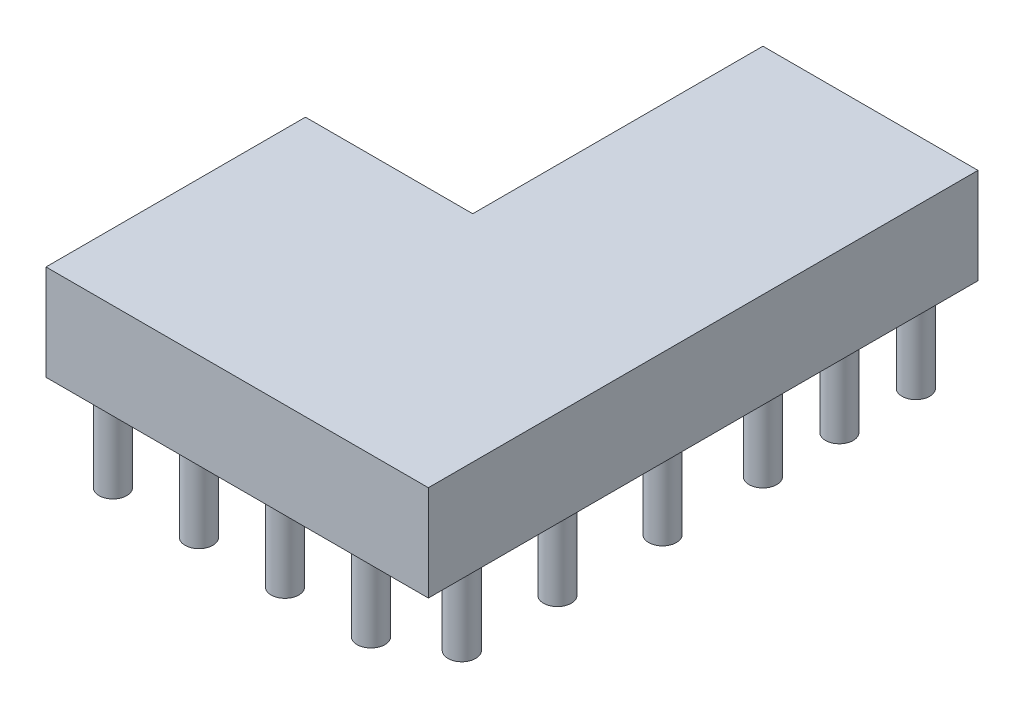
ISO-10303-21;
HEADER;
FILE_DESCRIPTION(('STEP AP214'),'2;1');
FILE_NAME('part.step','',(''),(''),'','','');
FILE_SCHEMA(('AUTOMOTIVE_DESIGN { 1 0 10303 214 1 1 1 1 }'));
ENDSEC;
DATA;
#1=APPLICATION_CONTEXT('core data for automotive mechanical design processes');
#2=APPLICATION_PROTOCOL_DEFINITION('international standard','automotive_design',2000,#1);
#3=PRODUCT_CONTEXT('',#1,'mechanical');
#4=PRODUCT('Part','Part','',(#3));
#5=PRODUCT_RELATED_PRODUCT_CATEGORY('part','',(#4));
#6=PRODUCT_DEFINITION_FORMATION('','',#4);
#7=PRODUCT_DEFINITION_CONTEXT('part definition',#1,'design');
#8=PRODUCT_DEFINITION('design','',#6,#7);
#9=PRODUCT_DEFINITION_SHAPE('','',#8);
#10=(LENGTH_UNIT() NAMED_UNIT(*) SI_UNIT(.MILLI.,.METRE.));
#11=(NAMED_UNIT(*) PLANE_ANGLE_UNIT() SI_UNIT($,.RADIAN.));
#12=(NAMED_UNIT(*) SI_UNIT($,.STERADIAN.) SOLID_ANGLE_UNIT());
#13=UNCERTAINTY_MEASURE_WITH_UNIT(LENGTH_MEASURE(1.E-05),#10,'distance_accuracy_value','');
#14=(GEOMETRIC_REPRESENTATION_CONTEXT(3) GLOBAL_UNCERTAINTY_ASSIGNED_CONTEXT((#13)) GLOBAL_UNIT_ASSIGNED_CONTEXT((#10,
#11,#12)) REPRESENTATION_CONTEXT('',''));
#15=CARTESIAN_POINT('',(0.,0.,0.));
#16=DIRECTION('',(0.,0.,1.));
#17=DIRECTION('',(1.,0.,0.));
#18=AXIS2_PLACEMENT_3D('',#15,#16,#17);
#19=CARTESIAN_POINT('',(-30.7782651691458,-20.,2.6856654690313));
#20=DIRECTION('',(0.,0.,-1.));
#21=DIRECTION('',(-1.,0.,0.));
#22=AXIS2_PLACEMENT_3D('',#19,#20,#21);
#23=PLANE('',#22);
#24=DIRECTION('',(-1.,0.,0.));
#25=VECTOR('',#24,1.);
#26=CARTESIAN_POINT('',(-30.7782651691458,0.,2.6856654690313));
#27=LINE('',#26,#25);
#28=CARTESIAN_POINT('',(-4.7863472081604,0.,2.6856654690313));
#29=VERTEX_POINT('',#28);
#30=CARTESIAN_POINT('',(-39.7863472081604,0.,2.6856654690313));
#31=VERTEX_POINT('',#30);
#32=EDGE_CURVE('E157',#29,#31,#27,.T.);
#33=ORIENTED_EDGE('',*,*,#32,.F.);
#34=DIRECTION('',(0.,1.,0.));
#35=VECTOR('',#34,1.);
#36=CARTESIAN_POINT('',(-4.7863472081604,-20.,2.6856654690313));
#37=LINE('',#36,#35);
#38=CARTESIAN_POINT('',(-4.7863472081604,-20.,2.6856654690313));
#39=VERTEX_POINT('',#38);
#40=EDGE_CURVE('E190',#39,#29,#37,.T.);
#41=ORIENTED_EDGE('',*,*,#40,.F.);
#42=DIRECTION('',(-1.,0.,0.));
#43=VECTOR('',#42,1.);
#44=CARTESIAN_POINT('',(-39.7863472081604,-20.,2.6856654690313));
#45=LINE('',#44,#43);
#46=CARTESIAN_POINT('',(-39.7863472081604,-20.,2.6856654690313));
#47=VERTEX_POINT('',#46);
#48=EDGE_CURVE('E153',#39,#47,#45,.T.);
#49=ORIENTED_EDGE('',*,*,#48,.T.);
#50=DIRECTION('',(0.,1.,0.));
#51=VECTOR('',#50,1.);
#52=CARTESIAN_POINT('',(-39.7863472081604,-20.,2.6856654690313));
#53=LINE('',#52,#51);
#54=EDGE_CURVE('E172',#47,#31,#53,.T.);
#55=ORIENTED_EDGE('',*,*,#54,.T.);
#56=EDGE_LOOP('',(#33,#41,#49,#55));
#57=FACE_BOUND('',#56,.T.);
#58=ADVANCED_FACE('F37',(#57),#23,.T.);
#59=CARTESIAN_POINT('',(-4.7863472081604,-20.,2.6856654690313));
#60=DIRECTION('',(-1.,0.,0.));
#61=DIRECTION('',(0.,0.,1.));
#62=AXIS2_PLACEMENT_3D('',#59,#60,#61);
#63=PLANE('',#62);
#64=DIRECTION('',(0.,0.,1.));
#65=VECTOR('',#64,1.);
#66=CARTESIAN_POINT('',(-4.7863472081604,0.,2.6856654690313));
#67=LINE('',#66,#65);
#68=CARTESIAN_POINT('',(-4.7863472081604,0.,-58.0286202452544));
#69=VERTEX_POINT('',#68);
#70=EDGE_CURVE('E186',#69,#29,#67,.T.);
#71=ORIENTED_EDGE('',*,*,#70,.F.);
#72=DIRECTION('',(0.,1.,0.));
#73=VECTOR('',#72,1.);
#74=CARTESIAN_POINT('',(-4.7863472081604,-20.,-58.0286202452544));
#75=LINE('',#74,#73);
#76=CARTESIAN_POINT('',(-4.7863472081604,-20.,-58.0286202452544));
#77=VERTEX_POINT('',#76);
#78=EDGE_CURVE('E193',#77,#69,#75,.T.);
#79=ORIENTED_EDGE('',*,*,#78,.F.);
#80=DIRECTION('',(0.,0.,1.));
#81=VECTOR('',#80,1.);
#82=CARTESIAN_POINT('',(-4.7863472081604,-20.,2.6856654690313));
#83=LINE('',#82,#81);
#84=EDGE_CURVE('E169',#77,#39,#83,.T.);
#85=ORIENTED_EDGE('',*,*,#84,.T.);
#86=ORIENTED_EDGE('',*,*,#40,.T.);
#87=EDGE_LOOP('',(#71,#79,#85,#86));
#88=FACE_BOUND('',#87,.T.);
#89=ADVANCED_FACE('F296',(#88),#63,.T.);
#90=CARTESIAN_POINT('',(-4.7863472081604,-20.,-58.0286202452544));
#91=DIRECTION('',(0.,0.,-1.));
#92=DIRECTION('',(-1.,0.,0.));
#93=AXIS2_PLACEMENT_3D('',#90,#91,#92);
#94=PLANE('',#93);
#95=DIRECTION('',(-1.,0.,0.));
#96=VECTOR('',#95,1.);
#97=CARTESIAN_POINT('',(-4.7863472081604,0.,-58.0286202452544));
#98=LINE('',#97,#96);
#99=CARTESIAN_POINT('',(40.2136527918396,0.,-58.0286202452544));
#100=VERTEX_POINT('',#99);
#101=EDGE_CURVE('E183',#100,#69,#98,.T.);
#102=ORIENTED_EDGE('',*,*,#101,.F.);
#103=DIRECTION('',(0.,1.,0.));
#104=VECTOR('',#103,1.);
#105=CARTESIAN_POINT('',(40.2136527918396,-20.,-58.0286202452544));
#106=LINE('',#105,#104);
#107=CARTESIAN_POINT('',(40.2136527918396,-20.,-58.0286202452544));
#108=VERTEX_POINT('',#107);
#109=EDGE_CURVE('E195',#108,#100,#106,.T.);
#110=ORIENTED_EDGE('',*,*,#109,.F.);
#111=DIRECTION('',(-1.,0.,0.));
#112=VECTOR('',#111,1.);
#113=CARTESIAN_POINT('',(-4.7863472081604,-20.,-58.0286202452544));
#114=LINE('',#113,#112);
#115=EDGE_CURVE('E166',#108,#77,#114,.T.);
#116=ORIENTED_EDGE('',*,*,#115,.T.);
#117=ORIENTED_EDGE('',*,*,#78,.T.);
#118=EDGE_LOOP('',(#102,#110,#116,#117));
#119=FACE_BOUND('',#118,.T.);
#120=ADVANCED_FACE('F299',(#119),#94,.T.);
#121=CARTESIAN_POINT('',(40.2136527918396,-20.,-58.0286202452544));
#122=DIRECTION('',(1.,0.,0.));
#123=DIRECTION('',(0.,0.,-1.));
#124=AXIS2_PLACEMENT_3D('',#121,#122,#123);
#125=PLANE('',#124);
#126=DIRECTION('',(0.,0.,-1.));
#127=VECTOR('',#126,1.);
#128=CARTESIAN_POINT('',(40.2136527918396,0.,-58.0286202452544));
#129=LINE('',#128,#127);
#130=CARTESIAN_POINT('',(40.2136527918396,0.,56.9713797547456));
#131=VERTEX_POINT('',#130);
#132=EDGE_CURVE('E180',#131,#100,#129,.T.);
#133=ORIENTED_EDGE('',*,*,#132,.F.);
#134=DIRECTION('',(0.,1.,0.));
#135=VECTOR('',#134,1.);
#136=CARTESIAN_POINT('',(40.2136527918396,-20.,56.9713797547456));
#137=LINE('',#136,#135);
#138=CARTESIAN_POINT('',(40.2136527918396,-20.,56.9713797547456));
#139=VERTEX_POINT('',#138);
#140=EDGE_CURVE('E197',#139,#131,#137,.T.);
#141=ORIENTED_EDGE('',*,*,#140,.F.);
#142=DIRECTION('',(0.,0.,-1.));
#143=VECTOR('',#142,1.);
#144=CARTESIAN_POINT('',(40.2136527918396,-20.,-58.0286202452544));
#145=LINE('',#144,#143);
#146=EDGE_CURVE('E163',#139,#108,#145,.T.);
#147=ORIENTED_EDGE('',*,*,#146,.T.);
#148=ORIENTED_EDGE('',*,*,#109,.T.);
#149=EDGE_LOOP('',(#133,#141,#147,#148));
#150=FACE_BOUND('',#149,.T.);
#151=ADVANCED_FACE('F303',(#150),#125,.T.);
#152=CARTESIAN_POINT('',(40.2136527918396,-20.,56.9713797547456));
#153=DIRECTION('',(0.,0.,1.));
#154=DIRECTION('',(1.,0.,0.));
#155=AXIS2_PLACEMENT_3D('',#152,#153,#154);
#156=PLANE('',#155);
#157=DIRECTION('',(1.,0.,0.));
#158=VECTOR('',#157,1.);
#159=CARTESIAN_POINT('',(40.2136527918396,0.,56.9713797547456));
#160=LINE('',#159,#158);
#161=CARTESIAN_POINT('',(-39.7863472081604,0.,56.9713797547456));
#162=VERTEX_POINT('',#161);
#163=EDGE_CURVE('E176',#162,#131,#160,.T.);
#164=ORIENTED_EDGE('',*,*,#163,.F.);
#165=DIRECTION('',(0.,1.,0.));
#166=VECTOR('',#165,1.);
#167=CARTESIAN_POINT('',(-39.7863472081604,-20.,56.9713797547456));
#168=LINE('',#167,#166);
#169=CARTESIAN_POINT('',(-39.7863472081604,-20.,56.9713797547456));
#170=VERTEX_POINT('',#169);
#171=EDGE_CURVE('E199',#170,#162,#168,.T.);
#172=ORIENTED_EDGE('',*,*,#171,.F.);
#173=DIRECTION('',(1.,0.,0.));
#174=VECTOR('',#173,1.);
#175=CARTESIAN_POINT('',(40.2136527918396,-20.,56.9713797547456));
#176=LINE('',#175,#174);
#177=EDGE_CURVE('E160',#170,#139,#176,.T.);
#178=ORIENTED_EDGE('',*,*,#177,.T.);
#179=ORIENTED_EDGE('',*,*,#140,.T.);
#180=EDGE_LOOP('',(#164,#172,#178,#179));
#181=FACE_BOUND('',#180,.T.);
#182=ADVANCED_FACE('F306',(#181),#156,.T.);
#183=CARTESIAN_POINT('',(-39.7863472081604,-20.,56.9713797547456));
#184=DIRECTION('',(-1.,0.,0.));
#185=DIRECTION('',(0.,0.,1.));
#186=AXIS2_PLACEMENT_3D('',#183,#184,#185);
#187=PLANE('',#186);
#188=DIRECTION('',(0.,0.,1.));
#189=VECTOR('',#188,1.);
#190=CARTESIAN_POINT('',(-39.7863472081604,0.,56.9713797547456));
#191=LINE('',#190,#189);
#192=EDGE_CURVE('E173',#31,#162,#191,.T.);
#193=ORIENTED_EDGE('',*,*,#192,.F.);
#194=ORIENTED_EDGE('',*,*,#54,.F.);
#195=DIRECTION('',(0.,0.,1.));
#196=VECTOR('',#195,1.);
#197=CARTESIAN_POINT('',(-39.7863472081604,-20.,56.9713797547456));
#198=LINE('',#197,#196);
#199=EDGE_CURVE('E156',#47,#170,#198,.T.);
#200=ORIENTED_EDGE('',*,*,#199,.T.);
#201=ORIENTED_EDGE('',*,*,#171,.T.);
#202=EDGE_LOOP('',(#193,#194,#200,#201));
#203=FACE_BOUND('',#202,.T.);
#204=ADVANCED_FACE('F39',(#203),#187,.T.);
#205=CARTESIAN_POINT('',(0.,-20.,0.));
#206=DIRECTION('',(0.,1.,0.));
#207=DIRECTION('',(0.,0.,1.));
#208=AXIS2_PLACEMENT_3D('',#205,#206,#207);
#209=PLANE('',#208);
#210=CARTESIAN_POINT('',(0.213652791839602,-20.,-16.3143345309687));
#211=DIRECTION('',(0.,1.,0.));
#212=DIRECTION('',(0.,0.,1.));
#213=AXIS2_PLACEMENT_3D('',#210,#211,#212);
#214=CIRCLE('',#213,2.9);
#215=CARTESIAN_POINT('',(0.213652791839602,-20.,-13.4143345309687));
#216=VERTEX_POINT('',#215);
#217=EDGE_CURVE('E11',#216,#216,#214,.F.);
#218=ORIENTED_EDGE('',*,*,#217,.F.);
#219=EDGE_LOOP('',(#218));
#220=FACE_BOUND('',#219,.T.);
#221=CARTESIAN_POINT('',(0.213652791839602,-20.,-34.3143345309687));
#222=DIRECTION('',(0.,1.,0.));
#223=DIRECTION('',(0.,0.,1.));
#224=AXIS2_PLACEMENT_3D('',#221,#222,#223);
#225=CIRCLE('',#224,2.9);
#226=CARTESIAN_POINT('',(0.213652791839602,-20.,-31.4143345309687));
#227=VERTEX_POINT('',#226);
#228=EDGE_CURVE('E45',#227,#227,#225,.F.);
#229=ORIENTED_EDGE('',*,*,#228,.F.);
#230=EDGE_LOOP('',(#229));
#231=FACE_BOUND('',#230,.T.);
#232=CARTESIAN_POINT('',(0.213652791839603,-20.,-52.3143345309687));
#233=DIRECTION('',(0.,1.,0.));
#234=DIRECTION('',(0.,0.,1.));
#235=AXIS2_PLACEMENT_3D('',#232,#233,#234);
#236=CIRCLE('',#235,2.9);
#237=CARTESIAN_POINT('',(0.213652791839603,-20.,-49.4143345309687));
#238=VERTEX_POINT('',#237);
#239=EDGE_CURVE('E241',#238,#238,#236,.F.);
#240=ORIENTED_EDGE('',*,*,#239,.F.);
#241=EDGE_LOOP('',(#240));
#242=FACE_BOUND('',#241,.T.);
#243=CARTESIAN_POINT('',(0.213652791839597,-20.,7.68566546903129));
#244=DIRECTION('',(0.,1.,0.));
#245=DIRECTION('',(0.,0.,1.));
#246=AXIS2_PLACEMENT_3D('',#243,#244,#245);
#247=CIRCLE('',#246,2.9);
#248=CARTESIAN_POINT('',(0.213652791839597,-20.,10.5856654690313));
#249=VERTEX_POINT('',#248);
#250=EDGE_CURVE('E238',#249,#249,#247,.F.);
#251=ORIENTED_EDGE('',*,*,#250,.F.);
#252=EDGE_LOOP('',(#251));
#253=FACE_BOUND('',#252,.T.);
#254=CARTESIAN_POINT('',(-12.7863472081604,-20.,7.68566546903129));
#255=DIRECTION('',(0.,1.,0.));
#256=DIRECTION('',(0.,0.,1.));
#257=AXIS2_PLACEMENT_3D('',#254,#255,#256);
#258=CIRCLE('',#257,2.9);
#259=CARTESIAN_POINT('',(-12.7863472081604,-20.,10.5856654690313));
#260=VERTEX_POINT('',#259);
#261=EDGE_CURVE('E235',#260,#260,#258,.F.);
#262=ORIENTED_EDGE('',*,*,#261,.F.);
#263=EDGE_LOOP('',(#262));
#264=FACE_BOUND('',#263,.T.);
#265=CARTESIAN_POINT('',(-28.7863472081604,-20.,7.68566546903129));
#266=DIRECTION('',(0.,1.,0.));
#267=DIRECTION('',(0.,0.,1.));
#268=AXIS2_PLACEMENT_3D('',#265,#266,#267);
#269=CIRCLE('',#268,2.9);
#270=CARTESIAN_POINT('',(-28.7863472081604,-20.,10.5856654690313));
#271=VERTEX_POINT('',#270);
#272=EDGE_CURVE('E232',#271,#271,#269,.F.);
#273=ORIENTED_EDGE('',*,*,#272,.F.);
#274=EDGE_LOOP('',(#273));
#275=FACE_BOUND('',#274,.T.);
#276=CARTESIAN_POINT('',(-30.7863472081604,-20.,51.9713797547456));
#277=DIRECTION('',(0.,1.,0.));
#278=DIRECTION('',(0.,0.,1.));
#279=AXIS2_PLACEMENT_3D('',#276,#277,#278);
#280=CIRCLE('',#279,2.9);
#281=CARTESIAN_POINT('',(-30.7863472081604,-20.,54.8713797547456));
#282=VERTEX_POINT('',#281);
#283=EDGE_CURVE('E229',#282,#282,#280,.F.);
#284=ORIENTED_EDGE('',*,*,#283,.F.);
#285=EDGE_LOOP('',(#284));
#286=FACE_BOUND('',#285,.T.);
#287=CARTESIAN_POINT('',(-12.7863472081604,-20.,51.9713797547456));
#288=DIRECTION('',(0.,1.,0.));
#289=DIRECTION('',(0.,0.,1.));
#290=AXIS2_PLACEMENT_3D('',#287,#288,#289);
#291=CIRCLE('',#290,2.9);
#292=CARTESIAN_POINT('',(-12.7863472081604,-20.,54.8713797547456));
#293=VERTEX_POINT('',#292);
#294=EDGE_CURVE('E226',#293,#293,#291,.F.);
#295=ORIENTED_EDGE('',*,*,#294,.F.);
#296=EDGE_LOOP('',(#295));
#297=FACE_BOUND('',#296,.T.);
#298=CARTESIAN_POINT('',(5.21365279183961,-20.,51.9713797547456));
#299=DIRECTION('',(0.,1.,0.));
#300=DIRECTION('',(0.,0.,1.));
#301=AXIS2_PLACEMENT_3D('',#298,#299,#300);
#302=CIRCLE('',#301,2.9);
#303=CARTESIAN_POINT('',(5.21365279183961,-20.,54.8713797547456));
#304=VERTEX_POINT('',#303);
#305=EDGE_CURVE('E223',#304,#304,#302,.F.);
#306=ORIENTED_EDGE('',*,*,#305,.F.);
#307=EDGE_LOOP('',(#306));
#308=FACE_BOUND('',#307,.T.);
#309=CARTESIAN_POINT('',(23.2136527918396,-20.,51.9713797547456));
#310=DIRECTION('',(0.,1.,0.));
#311=DIRECTION('',(0.,0.,1.));
#312=AXIS2_PLACEMENT_3D('',#309,#310,#311);
#313=CIRCLE('',#312,2.9);
#314=CARTESIAN_POINT('',(23.2136527918396,-20.,54.8713797547456));
#315=VERTEX_POINT('',#314);
#316=EDGE_CURVE('E220',#315,#315,#313,.F.);
#317=ORIENTED_EDGE('',*,*,#316,.F.);
#318=EDGE_LOOP('',(#317));
#319=FACE_BOUND('',#318,.T.);
#320=CARTESIAN_POINT('',(35.2136527918396,-20.,-50.0286202452544));
#321=DIRECTION('',(0.,1.,0.));
#322=DIRECTION('',(0.,0.,1.));
#323=AXIS2_PLACEMENT_3D('',#320,#321,#322);
#324=CIRCLE('',#323,2.9);
#325=CARTESIAN_POINT('',(35.2136527918396,-20.,-47.1286202452544));
#326=VERTEX_POINT('',#325);
#327=EDGE_CURVE('E217',#326,#326,#324,.F.);
#328=ORIENTED_EDGE('',*,*,#327,.F.);
#329=EDGE_LOOP('',(#328));
#330=FACE_BOUND('',#329,.T.);
#331=CARTESIAN_POINT('',(35.2136527918396,-20.,-34.0286202452544));
#332=DIRECTION('',(0.,1.,0.));
#333=DIRECTION('',(0.,0.,1.));
#334=AXIS2_PLACEMENT_3D('',#331,#332,#333);
#335=CIRCLE('',#334,2.9);
#336=CARTESIAN_POINT('',(35.2136527918396,-20.,-31.1286202452544));
#337=VERTEX_POINT('',#336);
#338=EDGE_CURVE('E214',#337,#337,#335,.F.);
#339=ORIENTED_EDGE('',*,*,#338,.F.);
#340=EDGE_LOOP('',(#339));
#341=FACE_BOUND('',#340,.T.);
#342=CARTESIAN_POINT('',(35.2136527918396,-20.,-18.0286202452544));
#343=DIRECTION('',(0.,1.,0.));
#344=DIRECTION('',(0.,0.,1.));
#345=AXIS2_PLACEMENT_3D('',#342,#343,#344);
#346=CIRCLE('',#345,2.9);
#347=CARTESIAN_POINT('',(35.2136527918396,-20.,-15.1286202452544));
#348=VERTEX_POINT('',#347);
#349=EDGE_CURVE('E211',#348,#348,#346,.F.);
#350=ORIENTED_EDGE('',*,*,#349,.F.);
#351=EDGE_LOOP('',(#350));
#352=FACE_BOUND('',#351,.T.);
#353=CARTESIAN_POINT('',(35.2136527918396,-20.,2.97137975474562));
#354=DIRECTION('',(0.,1.,0.));
#355=DIRECTION('',(0.,0.,1.));
#356=AXIS2_PLACEMENT_3D('',#353,#354,#355);
#357=CIRCLE('',#356,2.9);
#358=CARTESIAN_POINT('',(35.2136527918396,-20.,5.87137975474562));
#359=VERTEX_POINT('',#358);
#360=EDGE_CURVE('E208',#359,#359,#357,.F.);
#361=ORIENTED_EDGE('',*,*,#360,.F.);
#362=EDGE_LOOP('',(#361));
#363=FACE_BOUND('',#362,.T.);
#364=CARTESIAN_POINT('',(35.2136527918396,-20.,24.9713797547456));
#365=DIRECTION('',(0.,1.,0.));
#366=DIRECTION('',(0.,0.,1.));
#367=AXIS2_PLACEMENT_3D('',#364,#365,#366);
#368=CIRCLE('',#367,2.9);
#369=CARTESIAN_POINT('',(35.2136527918396,-20.,27.8713797547456));
#370=VERTEX_POINT('',#369);
#371=EDGE_CURVE('E205',#370,#370,#368,.F.);
#372=ORIENTED_EDGE('',*,*,#371,.F.);
#373=EDGE_LOOP('',(#372));
#374=FACE_BOUND('',#373,.T.);
#375=CARTESIAN_POINT('',(35.2136527918396,-20.,44.9713797547456));
#376=DIRECTION('',(0.,1.,0.));
#377=DIRECTION('',(0.,0.,1.));
#378=AXIS2_PLACEMENT_3D('',#375,#376,#377);
#379=CIRCLE('',#378,2.9);
#380=CARTESIAN_POINT('',(35.2136527918396,-20.,47.8713797547456));
#381=VERTEX_POINT('',#380);
#382=EDGE_CURVE('E192',#381,#381,#379,.F.);
#383=ORIENTED_EDGE('',*,*,#382,.F.);
#384=EDGE_LOOP('',(#383));
#385=FACE_BOUND('',#384,.T.);
#386=DIRECTION('',(1.,0.,0.));
#387=VECTOR('',#386,1.);
#388=CARTESIAN_POINT('',(-34.7863472081604,-20.,46.9713797547456));
#389=LINE('',#388,#387);
#390=CARTESIAN_POINT('',(-34.7863472081604,-20.,46.9713797547456));
#391=VERTEX_POINT('',#390);
#392=CARTESIAN_POINT('',(30.2136527918396,-20.,46.9713797547456));
#393=VERTEX_POINT('',#392);
#394=EDGE_CURVE('E152',#391,#393,#389,.T.);
#395=ORIENTED_EDGE('',*,*,#394,.T.);
#396=DIRECTION('',(0.,0.,-1.));
#397=VECTOR('',#396,1.);
#398=CARTESIAN_POINT('',(30.2136527918396,-20.,6.9713797547456));
#399=LINE('',#398,#397);
#400=CARTESIAN_POINT('',(30.2136527918396,-20.,-53.0286202452544));
#401=VERTEX_POINT('',#400);
#402=EDGE_CURVE('E692',#393,#401,#399,.T.);
#403=ORIENTED_EDGE('',*,*,#402,.T.);
#404=DIRECTION('',(-1.,0.,0.));
#405=VECTOR('',#404,1.);
#406=CARTESIAN_POINT('',(30.2136527918396,-20.,-53.0286202452544));
#407=LINE('',#406,#405);
#408=CARTESIAN_POINT('',(5.2136527918396,-20.,-53.0286202452544));
#409=VERTEX_POINT('',#408);
#410=EDGE_CURVE('E689',#401,#409,#407,.T.);
#411=ORIENTED_EDGE('',*,*,#410,.T.);
#412=DIRECTION('',(0.,0.,1.));
#413=VECTOR('',#412,1.);
#414=CARTESIAN_POINT('',(5.2136527918396,-20.,12.6856654690313));
#415=LINE('',#414,#413);
#416=CARTESIAN_POINT('',(5.2136527918396,-20.,12.6856654690313));
#417=VERTEX_POINT('',#416);
#418=EDGE_CURVE('E60',#409,#417,#415,.T.);
#419=ORIENTED_EDGE('',*,*,#418,.T.);
#420=DIRECTION('',(-1.,0.,0.));
#421=VECTOR('',#420,1.);
#422=CARTESIAN_POINT('',(-34.7863472081604,-20.,12.6856654690313));
#423=LINE('',#422,#421);
#424=CARTESIAN_POINT('',(-34.7863472081604,-20.,12.6856654690313));
#425=VERTEX_POINT('',#424);
#426=EDGE_CURVE('E141',#417,#425,#423,.T.);
#427=ORIENTED_EDGE('',*,*,#426,.T.);
#428=DIRECTION('',(0.,0.,1.));
#429=VECTOR('',#428,1.);
#430=CARTESIAN_POINT('',(-34.7863472081604,-20.,46.9713797547456));
#431=LINE('',#430,#429);
#432=EDGE_CURVE('E706',#425,#391,#431,.T.);
#433=ORIENTED_EDGE('',*,*,#432,.T.);
#434=EDGE_LOOP('',(#395,#403,#411,#419,#427,#433));
#435=FACE_BOUND('',#434,.T.);
#436=ORIENTED_EDGE('',*,*,#48,.F.);
#437=ORIENTED_EDGE('',*,*,#84,.F.);
#438=ORIENTED_EDGE('',*,*,#115,.F.);
#439=ORIENTED_EDGE('',*,*,#146,.F.);
#440=ORIENTED_EDGE('',*,*,#177,.F.);
#441=ORIENTED_EDGE('',*,*,#199,.F.);
#442=EDGE_LOOP('',(#436,#437,#438,#439,#440,#441));
#443=FACE_BOUND('',#442,.T.);
#444=ADVANCED_FACE('F248',(#220,#231,#242,#253,#264,#275,#286,#297,#308,#319,#330,#341,#352,
#363,#374,#385,#435,#443),#209,.F.);
#445=CARTESIAN_POINT('',(0.,0.,0.));
#446=DIRECTION('',(0.,1.,0.));
#447=DIRECTION('',(0.,0.,1.));
#448=AXIS2_PLACEMENT_3D('',#445,#446,#447);
#449=PLANE('',#448);
#450=ORIENTED_EDGE('',*,*,#32,.T.);
#451=ORIENTED_EDGE('',*,*,#192,.T.);
#452=ORIENTED_EDGE('',*,*,#163,.T.);
#453=ORIENTED_EDGE('',*,*,#132,.T.);
#454=ORIENTED_EDGE('',*,*,#101,.T.);
#455=ORIENTED_EDGE('',*,*,#70,.T.);
#456=EDGE_LOOP('',(#450,#451,#452,#453,#454,#455));
#457=FACE_BOUND('',#456,.T.);
#458=ADVANCED_FACE('F251',(#457),#449,.T.);
#459=CARTESIAN_POINT('',(30.2136527918396,-20.,46.9713797547456));
#460=DIRECTION('',(1.,0.,0.));
#461=DIRECTION('',(0.,0.,-1.));
#462=AXIS2_PLACEMENT_3D('',#459,#460,#461);
#463=PLANE('',#462);
#464=DIRECTION('',(0.,1.,0.));
#465=VECTOR('',#464,1.);
#466=CARTESIAN_POINT('',(30.2136527918396,-20.,46.9713797547456));
#467=LINE('',#466,#465);
#468=CARTESIAN_POINT('',(30.2136527918396,-9.,46.9713797547456));
#469=VERTEX_POINT('',#468);
#470=EDGE_CURVE('E177',#393,#469,#467,.T.);
#471=ORIENTED_EDGE('',*,*,#470,.T.);
#472=DIRECTION('',(0.,0.,-1.));
#473=VECTOR('',#472,1.);
#474=CARTESIAN_POINT('',(30.2136527918396,-9.,-53.0286202452544));
#475=LINE('',#474,#473);
#476=CARTESIAN_POINT('',(30.2136527918396,-9.,-53.0286202452544));
#477=VERTEX_POINT('',#476);
#478=EDGE_CURVE('E694',#469,#477,#475,.T.);
#479=ORIENTED_EDGE('',*,*,#478,.T.);
#480=DIRECTION('',(0.,1.,0.));
#481=VECTOR('',#480,1.);
#482=CARTESIAN_POINT('',(30.2136527918396,-20.,-53.0286202452544));
#483=LINE('',#482,#481);
#484=EDGE_CURVE('E146',#401,#477,#483,.T.);
#485=ORIENTED_EDGE('',*,*,#484,.F.);
#486=ORIENTED_EDGE('',*,*,#402,.F.);
#487=EDGE_LOOP('',(#471,#479,#485,#486));
#488=FACE_BOUND('',#487,.T.);
#489=ADVANCED_FACE('F311',(#488),#463,.F.);
#490=CARTESIAN_POINT('',(-34.7863472081604,-20.,46.9713797547456));
#491=DIRECTION('',(0.,0.,1.));
#492=DIRECTION('',(1.,0.,0.));
#493=AXIS2_PLACEMENT_3D('',#490,#491,#492);
#494=PLANE('',#493);
#495=DIRECTION('',(0.,1.,0.));
#496=VECTOR('',#495,1.);
#497=CARTESIAN_POINT('',(-34.7863472081604,-20.,46.9713797547456));
#498=LINE('',#497,#496);
#499=CARTESIAN_POINT('',(-34.7863472081604,-9.,46.9713797547456));
#500=VERTEX_POINT('',#499);
#501=EDGE_CURVE('E144',#391,#500,#498,.T.);
#502=ORIENTED_EDGE('',*,*,#501,.T.);
#503=DIRECTION('',(1.,0.,0.));
#504=VECTOR('',#503,1.);
#505=CARTESIAN_POINT('',(30.2136527918396,-9.,46.9713797547456));
#506=LINE('',#505,#504);
#507=EDGE_CURVE('E696',#500,#469,#506,.T.);
#508=ORIENTED_EDGE('',*,*,#507,.T.);
#509=ORIENTED_EDGE('',*,*,#470,.F.);
#510=ORIENTED_EDGE('',*,*,#394,.F.);
#511=EDGE_LOOP('',(#502,#508,#509,#510));
#512=FACE_BOUND('',#511,.T.);
#513=ADVANCED_FACE('F316',(#512),#494,.F.);
#514=CARTESIAN_POINT('',(-34.7863472081604,-20.,46.9713797547456));
#515=DIRECTION('',(-1.,0.,0.));
#516=DIRECTION('',(0.,0.,1.));
#517=AXIS2_PLACEMENT_3D('',#514,#515,#516);
#518=PLANE('',#517);
#519=DIRECTION('',(0.,1.,0.));
#520=VECTOR('',#519,1.);
#521=CARTESIAN_POINT('',(-34.7863472081604,-20.,12.6856654690313));
#522=LINE('',#521,#520);
#523=CARTESIAN_POINT('',(-34.7863472081604,-9.,12.6856654690313));
#524=VERTEX_POINT('',#523);
#525=EDGE_CURVE('E142',#425,#524,#522,.T.);
#526=ORIENTED_EDGE('',*,*,#525,.T.);
#527=DIRECTION('',(0.,0.,1.));
#528=VECTOR('',#527,1.);
#529=CARTESIAN_POINT('',(-34.7863472081604,-9.,46.9713797547456));
#530=LINE('',#529,#528);
#531=EDGE_CURVE('E128',#524,#500,#530,.T.);
#532=ORIENTED_EDGE('',*,*,#531,.T.);
#533=ORIENTED_EDGE('',*,*,#501,.F.);
#534=ORIENTED_EDGE('',*,*,#432,.F.);
#535=EDGE_LOOP('',(#526,#532,#533,#534));
#536=FACE_BOUND('',#535,.T.);
#537=ADVANCED_FACE('F674',(#536),#518,.F.);
#538=CARTESIAN_POINT('',(-34.7863472081604,-20.,12.6856654690313));
#539=DIRECTION('',(0.,0.,-1.));
#540=DIRECTION('',(-1.,0.,0.));
#541=AXIS2_PLACEMENT_3D('',#538,#539,#540);
#542=PLANE('',#541);
#543=DIRECTION('',(0.,1.,0.));
#544=VECTOR('',#543,1.);
#545=CARTESIAN_POINT('',(5.2136527918396,-20.,12.6856654690313));
#546=LINE('',#545,#544);
#547=CARTESIAN_POINT('',(5.2136527918396,-9.,12.6856654690313));
#548=VERTEX_POINT('',#547);
#549=EDGE_CURVE('E134',#417,#548,#546,.T.);
#550=ORIENTED_EDGE('',*,*,#549,.T.);
#551=DIRECTION('',(-1.,0.,0.));
#552=VECTOR('',#551,1.);
#553=CARTESIAN_POINT('',(-34.7863472081604,-9.,12.6856654690313));
#554=LINE('',#553,#552);
#555=EDGE_CURVE('E125',#548,#524,#554,.T.);
#556=ORIENTED_EDGE('',*,*,#555,.T.);
#557=ORIENTED_EDGE('',*,*,#525,.F.);
#558=ORIENTED_EDGE('',*,*,#426,.F.);
#559=EDGE_LOOP('',(#550,#556,#557,#558));
#560=FACE_BOUND('',#559,.T.);
#561=ADVANCED_FACE('F139',(#560),#542,.F.);
#562=CARTESIAN_POINT('',(5.2136527918396,-20.,12.6856654690313));
#563=DIRECTION('',(-1.,0.,0.));
#564=DIRECTION('',(0.,0.,1.));
#565=AXIS2_PLACEMENT_3D('',#562,#563,#564);
#566=PLANE('',#565);
#567=DIRECTION('',(0.,1.,0.));
#568=VECTOR('',#567,1.);
#569=CARTESIAN_POINT('',(5.2136527918396,-20.,-53.0286202452544));
#570=LINE('',#569,#568);
#571=CARTESIAN_POINT('',(5.2136527918396,-9.,-53.0286202452544));
#572=VERTEX_POINT('',#571);
#573=EDGE_CURVE('E136',#409,#572,#570,.T.);
#574=ORIENTED_EDGE('',*,*,#573,.T.);
#575=DIRECTION('',(0.,0.,1.));
#576=VECTOR('',#575,1.);
#577=CARTESIAN_POINT('',(5.2136527918396,-9.,12.6856654690313));
#578=LINE('',#577,#576);
#579=EDGE_CURVE('E52',#572,#548,#578,.T.);
#580=ORIENTED_EDGE('',*,*,#579,.T.);
#581=ORIENTED_EDGE('',*,*,#549,.F.);
#582=ORIENTED_EDGE('',*,*,#418,.F.);
#583=EDGE_LOOP('',(#574,#580,#581,#582));
#584=FACE_BOUND('',#583,.T.);
#585=ADVANCED_FACE('F133',(#584),#566,.F.);
#586=CARTESIAN_POINT('',(30.2136527918396,-20.,-53.0286202452544));
#587=DIRECTION('',(0.,0.,-1.));
#588=DIRECTION('',(-1.,0.,0.));
#589=AXIS2_PLACEMENT_3D('',#586,#587,#588);
#590=PLANE('',#589);
#591=ORIENTED_EDGE('',*,*,#484,.T.);
#592=DIRECTION('',(-1.,0.,0.));
#593=VECTOR('',#592,1.);
#594=CARTESIAN_POINT('',(5.2136527918396,-9.,-53.0286202452544));
#595=LINE('',#594,#593);
#596=EDGE_CURVE('E687',#477,#572,#595,.T.);
#597=ORIENTED_EDGE('',*,*,#596,.T.);
#598=ORIENTED_EDGE('',*,*,#573,.F.);
#599=ORIENTED_EDGE('',*,*,#410,.F.);
#600=EDGE_LOOP('',(#591,#597,#598,#599));
#601=FACE_BOUND('',#600,.T.);
#602=ADVANCED_FACE('F670',(#601),#590,.F.);
#603=CARTESIAN_POINT('',(0.,-9.,0.));
#604=DIRECTION('',(0.,-1.,0.));
#605=DIRECTION('',(0.,0.,-1.));
#606=AXIS2_PLACEMENT_3D('',#603,#604,#605);
#607=PLANE('',#606);
#608=ORIENTED_EDGE('',*,*,#579,.F.);
#609=ORIENTED_EDGE('',*,*,#596,.F.);
#610=ORIENTED_EDGE('',*,*,#478,.F.);
#611=ORIENTED_EDGE('',*,*,#507,.F.);
#612=ORIENTED_EDGE('',*,*,#531,.F.);
#613=ORIENTED_EDGE('',*,*,#555,.F.);
#614=EDGE_LOOP('',(#608,#609,#610,#611,#612,#613));
#615=FACE_BOUND('',#614,.T.);
#616=ADVANCED_FACE('F126',(#615),#607,.T.);
#617=CARTESIAN_POINT('',(35.2136527918396,-38.,44.9713797547456));
#618=DIRECTION('',(0.,1.,0.));
#619=DIRECTION('',(0.,0.,1.));
#620=AXIS2_PLACEMENT_3D('',#617,#618,#619);
#621=CYLINDRICAL_SURFACE('',#620,2.9);
#622=CARTESIAN_POINT('',(35.2136527918396,-38.,44.9713797547456));
#623=DIRECTION('',(0.,-1.,0.));
#624=DIRECTION('',(0.,0.,-1.));
#625=AXIS2_PLACEMENT_3D('',#622,#623,#624);
#626=CIRCLE('',#625,2.9);
#627=CARTESIAN_POINT('',(35.2136527918396,-38.,42.0713797547456));
#628=VERTEX_POINT('',#627);
#629=EDGE_CURVE('E137',#628,#628,#626,.T.);
#630=ORIENTED_EDGE('',*,*,#629,.F.);
#631=EDGE_LOOP('',(#630));
#632=FACE_BOUND('',#631,.T.);
#633=ORIENTED_EDGE('',*,*,#382,.T.);
#634=EDGE_LOOP('',(#633));
#635=FACE_BOUND('',#634,.T.);
#636=ADVANCED_FACE('F350',(#632,#635),#621,.T.);
#637=CARTESIAN_POINT('',(35.2136527918396,-38.,44.9713797547456));
#638=DIRECTION('',(0.,-1.,0.));
#639=DIRECTION('',(0.,0.,-1.));
#640=AXIS2_PLACEMENT_3D('',#637,#638,#639);
#641=PLANE('',#640);
#642=ORIENTED_EDGE('',*,*,#629,.T.);
#643=EDGE_LOOP('',(#642));
#644=FACE_BOUND('',#643,.T.);
#645=ADVANCED_FACE('F355',(#644),#641,.T.);
#646=CARTESIAN_POINT('',(35.2136527918396,-38.,24.9713797547456));
#647=DIRECTION('',(0.,1.,0.));
#648=DIRECTION('',(0.,0.,1.));
#649=AXIS2_PLACEMENT_3D('',#646,#647,#648);
#650=CYLINDRICAL_SURFACE('',#649,2.9);
#651=CARTESIAN_POINT('',(35.2136527918396,-38.,24.9713797547456));
#652=DIRECTION('',(0.,-1.,0.));
#653=DIRECTION('',(0.,0.,-1.));
#654=AXIS2_PLACEMENT_3D('',#651,#652,#653);
#655=CIRCLE('',#654,2.9);
#656=CARTESIAN_POINT('',(35.2136527918396,-38.,22.0713797547456));
#657=VERTEX_POINT('',#656);
#658=EDGE_CURVE('E714',#657,#657,#655,.T.);
#659=ORIENTED_EDGE('',*,*,#658,.F.);
#660=EDGE_LOOP('',(#659));
#661=FACE_BOUND('',#660,.T.);
#662=ORIENTED_EDGE('',*,*,#371,.T.);
#663=EDGE_LOOP('',(#662));
#664=FACE_BOUND('',#663,.T.);
#665=ADVANCED_FACE('F365',(#661,#664),#650,.T.);
#666=CARTESIAN_POINT('',(35.2136527918396,-38.,24.9713797547456));
#667=DIRECTION('',(0.,-1.,0.));
#668=DIRECTION('',(0.,0.,-1.));
#669=AXIS2_PLACEMENT_3D('',#666,#667,#668);
#670=PLANE('',#669);
#671=ORIENTED_EDGE('',*,*,#658,.T.);
#672=EDGE_LOOP('',(#671));
#673=FACE_BOUND('',#672,.T.);
#674=ADVANCED_FACE('F375',(#673),#670,.T.);
#675=CARTESIAN_POINT('',(35.2136527918396,-38.,2.97137975474562));
#676=DIRECTION('',(0.,1.,0.));
#677=DIRECTION('',(0.,0.,1.));
#678=AXIS2_PLACEMENT_3D('',#675,#676,#677);
#679=CYLINDRICAL_SURFACE('',#678,2.9);
#680=CARTESIAN_POINT('',(35.2136527918396,-38.,2.97137975474562));
#681=DIRECTION('',(0.,-1.,0.));
#682=DIRECTION('',(0.,0.,-1.));
#683=AXIS2_PLACEMENT_3D('',#680,#681,#682);
#684=CIRCLE('',#683,2.9);
#685=CARTESIAN_POINT('',(35.2136527918396,-38.,0.0713797547456201));
#686=VERTEX_POINT('',#685);
#687=EDGE_CURVE('E717',#686,#686,#684,.T.);
#688=ORIENTED_EDGE('',*,*,#687,.F.);
#689=EDGE_LOOP('',(#688));
#690=FACE_BOUND('',#689,.T.);
#691=ORIENTED_EDGE('',*,*,#360,.T.);
#692=EDGE_LOOP('',(#691));
#693=FACE_BOUND('',#692,.T.);
#694=ADVANCED_FACE('F385',(#690,#693),#679,.T.);
#695=CARTESIAN_POINT('',(35.2136527918396,-38.,2.97137975474562));
#696=DIRECTION('',(0.,-1.,0.));
#697=DIRECTION('',(0.,0.,-1.));
#698=AXIS2_PLACEMENT_3D('',#695,#696,#697);
#699=PLANE('',#698);
#700=ORIENTED_EDGE('',*,*,#687,.T.);
#701=EDGE_LOOP('',(#700));
#702=FACE_BOUND('',#701,.T.);
#703=ADVANCED_FACE('F395',(#702),#699,.T.);
#704=CARTESIAN_POINT('',(35.2136527918396,-38.,-18.0286202452544));
#705=DIRECTION('',(0.,1.,0.));
#706=DIRECTION('',(0.,0.,1.));
#707=AXIS2_PLACEMENT_3D('',#704,#705,#706);
#708=CYLINDRICAL_SURFACE('',#707,2.9);
#709=CARTESIAN_POINT('',(35.2136527918396,-38.,-18.0286202452544));
#710=DIRECTION('',(0.,-1.,0.));
#711=DIRECTION('',(0.,0.,-1.));
#712=AXIS2_PLACEMENT_3D('',#709,#710,#711);
#713=CIRCLE('',#712,2.9);
#714=CARTESIAN_POINT('',(35.2136527918396,-38.,-20.9286202452544));
#715=VERTEX_POINT('',#714);
#716=EDGE_CURVE('E720',#715,#715,#713,.T.);
#717=ORIENTED_EDGE('',*,*,#716,.F.);
#718=EDGE_LOOP('',(#717));
#719=FACE_BOUND('',#718,.T.);
#720=ORIENTED_EDGE('',*,*,#349,.T.);
#721=EDGE_LOOP('',(#720));
#722=FACE_BOUND('',#721,.T.);
#723=ADVANCED_FACE('F405',(#719,#722),#708,.T.);
#724=CARTESIAN_POINT('',(35.2136527918396,-38.,-18.0286202452544));
#725=DIRECTION('',(0.,-1.,0.));
#726=DIRECTION('',(0.,0.,-1.));
#727=AXIS2_PLACEMENT_3D('',#724,#725,#726);
#728=PLANE('',#727);
#729=ORIENTED_EDGE('',*,*,#716,.T.);
#730=EDGE_LOOP('',(#729));
#731=FACE_BOUND('',#730,.T.);
#732=ADVANCED_FACE('F415',(#731),#728,.T.);
#733=CARTESIAN_POINT('',(35.2136527918396,-38.,-34.0286202452544));
#734=DIRECTION('',(0.,1.,0.));
#735=DIRECTION('',(0.,0.,1.));
#736=AXIS2_PLACEMENT_3D('',#733,#734,#735);
#737=CYLINDRICAL_SURFACE('',#736,2.9);
#738=CARTESIAN_POINT('',(35.2136527918396,-38.,-34.0286202452544));
#739=DIRECTION('',(0.,-1.,0.));
#740=DIRECTION('',(0.,0.,-1.));
#741=AXIS2_PLACEMENT_3D('',#738,#739,#740);
#742=CIRCLE('',#741,2.9);
#743=CARTESIAN_POINT('',(35.2136527918396,-38.,-36.9286202452544));
#744=VERTEX_POINT('',#743);
#745=EDGE_CURVE('E723',#744,#744,#742,.T.);
#746=ORIENTED_EDGE('',*,*,#745,.F.);
#747=EDGE_LOOP('',(#746));
#748=FACE_BOUND('',#747,.T.);
#749=ORIENTED_EDGE('',*,*,#338,.T.);
#750=EDGE_LOOP('',(#749));
#751=FACE_BOUND('',#750,.T.);
#752=ADVANCED_FACE('F425',(#748,#751),#737,.T.);
#753=CARTESIAN_POINT('',(35.2136527918396,-38.,-34.0286202452544));
#754=DIRECTION('',(0.,-1.,0.));
#755=DIRECTION('',(0.,0.,-1.));
#756=AXIS2_PLACEMENT_3D('',#753,#754,#755);
#757=PLANE('',#756);
#758=ORIENTED_EDGE('',*,*,#745,.T.);
#759=EDGE_LOOP('',(#758));
#760=FACE_BOUND('',#759,.T.);
#761=ADVANCED_FACE('F435',(#760),#757,.T.);
#762=CARTESIAN_POINT('',(35.2136527918396,-38.,-50.0286202452544));
#763=DIRECTION('',(0.,1.,0.));
#764=DIRECTION('',(0.,0.,1.));
#765=AXIS2_PLACEMENT_3D('',#762,#763,#764);
#766=CYLINDRICAL_SURFACE('',#765,2.9);
#767=CARTESIAN_POINT('',(35.2136527918396,-38.,-50.0286202452544));
#768=DIRECTION('',(0.,-1.,0.));
#769=DIRECTION('',(0.,0.,-1.));
#770=AXIS2_PLACEMENT_3D('',#767,#768,#769);
#771=CIRCLE('',#770,2.9);
#772=CARTESIAN_POINT('',(35.2136527918396,-38.,-52.9286202452544));
#773=VERTEX_POINT('',#772);
#774=EDGE_CURVE('E726',#773,#773,#771,.T.);
#775=ORIENTED_EDGE('',*,*,#774,.F.);
#776=EDGE_LOOP('',(#775));
#777=FACE_BOUND('',#776,.T.);
#778=ORIENTED_EDGE('',*,*,#327,.T.);
#779=EDGE_LOOP('',(#778));
#780=FACE_BOUND('',#779,.T.);
#781=ADVANCED_FACE('F445',(#777,#780),#766,.T.);
#782=CARTESIAN_POINT('',(35.2136527918396,-38.,-50.0286202452544));
#783=DIRECTION('',(0.,-1.,0.));
#784=DIRECTION('',(0.,0.,-1.));
#785=AXIS2_PLACEMENT_3D('',#782,#783,#784);
#786=PLANE('',#785);
#787=ORIENTED_EDGE('',*,*,#774,.T.);
#788=EDGE_LOOP('',(#787));
#789=FACE_BOUND('',#788,.T.);
#790=ADVANCED_FACE('F455',(#789),#786,.T.);
#791=CARTESIAN_POINT('',(23.2136527918396,-38.,51.9713797547456));
#792=DIRECTION('',(0.,1.,0.));
#793=DIRECTION('',(0.,0.,1.));
#794=AXIS2_PLACEMENT_3D('',#791,#792,#793);
#795=CYLINDRICAL_SURFACE('',#794,2.9);
#796=CARTESIAN_POINT('',(23.2136527918396,-38.,51.9713797547456));
#797=DIRECTION('',(0.,-1.,0.));
#798=DIRECTION('',(0.,0.,-1.));
#799=AXIS2_PLACEMENT_3D('',#796,#797,#798);
#800=CIRCLE('',#799,2.9);
#801=CARTESIAN_POINT('',(23.2136527918396,-38.,49.0713797547456));
#802=VERTEX_POINT('',#801);
#803=EDGE_CURVE('E729',#802,#802,#800,.T.);
#804=ORIENTED_EDGE('',*,*,#803,.F.);
#805=EDGE_LOOP('',(#804));
#806=FACE_BOUND('',#805,.T.);
#807=ORIENTED_EDGE('',*,*,#316,.T.);
#808=EDGE_LOOP('',(#807));
#809=FACE_BOUND('',#808,.T.);
#810=ADVANCED_FACE('F465',(#806,#809),#795,.T.);
#811=CARTESIAN_POINT('',(23.2136527918396,-38.,51.9713797547456));
#812=DIRECTION('',(0.,-1.,0.));
#813=DIRECTION('',(0.,0.,-1.));
#814=AXIS2_PLACEMENT_3D('',#811,#812,#813);
#815=PLANE('',#814);
#816=ORIENTED_EDGE('',*,*,#803,.T.);
#817=EDGE_LOOP('',(#816));
#818=FACE_BOUND('',#817,.T.);
#819=ADVANCED_FACE('F475',(#818),#815,.T.);
#820=CARTESIAN_POINT('',(5.21365279183961,-38.,51.9713797547456));
#821=DIRECTION('',(0.,1.,0.));
#822=DIRECTION('',(0.,0.,1.));
#823=AXIS2_PLACEMENT_3D('',#820,#821,#822);
#824=CYLINDRICAL_SURFACE('',#823,2.9);
#825=CARTESIAN_POINT('',(5.21365279183961,-38.,51.9713797547456));
#826=DIRECTION('',(0.,-1.,0.));
#827=DIRECTION('',(0.,0.,-1.));
#828=AXIS2_PLACEMENT_3D('',#825,#826,#827);
#829=CIRCLE('',#828,2.9);
#830=CARTESIAN_POINT('',(5.21365279183961,-38.,49.0713797547456));
#831=VERTEX_POINT('',#830);
#832=EDGE_CURVE('E732',#831,#831,#829,.T.);
#833=ORIENTED_EDGE('',*,*,#832,.F.);
#834=EDGE_LOOP('',(#833));
#835=FACE_BOUND('',#834,.T.);
#836=ORIENTED_EDGE('',*,*,#305,.T.);
#837=EDGE_LOOP('',(#836));
#838=FACE_BOUND('',#837,.T.);
#839=ADVANCED_FACE('F485',(#835,#838),#824,.T.);
#840=CARTESIAN_POINT('',(5.21365279183961,-38.,51.9713797547456));
#841=DIRECTION('',(0.,-1.,0.));
#842=DIRECTION('',(0.,0.,-1.));
#843=AXIS2_PLACEMENT_3D('',#840,#841,#842);
#844=PLANE('',#843);
#845=ORIENTED_EDGE('',*,*,#832,.T.);
#846=EDGE_LOOP('',(#845));
#847=FACE_BOUND('',#846,.T.);
#848=ADVANCED_FACE('F495',(#847),#844,.T.);
#849=CARTESIAN_POINT('',(-12.7863472081604,-38.,51.9713797547456));
#850=DIRECTION('',(0.,1.,0.));
#851=DIRECTION('',(0.,0.,1.));
#852=AXIS2_PLACEMENT_3D('',#849,#850,#851);
#853=CYLINDRICAL_SURFACE('',#852,2.9);
#854=CARTESIAN_POINT('',(-12.7863472081604,-38.,51.9713797547456));
#855=DIRECTION('',(0.,-1.,0.));
#856=DIRECTION('',(0.,0.,-1.));
#857=AXIS2_PLACEMENT_3D('',#854,#855,#856);
#858=CIRCLE('',#857,2.9);
#859=CARTESIAN_POINT('',(-12.7863472081604,-38.,49.0713797547456));
#860=VERTEX_POINT('',#859);
#861=EDGE_CURVE('E735',#860,#860,#858,.T.);
#862=ORIENTED_EDGE('',*,*,#861,.F.);
#863=EDGE_LOOP('',(#862));
#864=FACE_BOUND('',#863,.T.);
#865=ORIENTED_EDGE('',*,*,#294,.T.);
#866=EDGE_LOOP('',(#865));
#867=FACE_BOUND('',#866,.T.);
#868=ADVANCED_FACE('F505',(#864,#867),#853,.T.);
#869=CARTESIAN_POINT('',(-12.7863472081604,-38.,51.9713797547456));
#870=DIRECTION('',(0.,-1.,0.));
#871=DIRECTION('',(0.,0.,-1.));
#872=AXIS2_PLACEMENT_3D('',#869,#870,#871);
#873=PLANE('',#872);
#874=ORIENTED_EDGE('',*,*,#861,.T.);
#875=EDGE_LOOP('',(#874));
#876=FACE_BOUND('',#875,.T.);
#877=ADVANCED_FACE('F515',(#876),#873,.T.);
#878=CARTESIAN_POINT('',(-30.7863472081604,-38.,51.9713797547456));
#879=DIRECTION('',(0.,1.,0.));
#880=DIRECTION('',(0.,0.,1.));
#881=AXIS2_PLACEMENT_3D('',#878,#879,#880);
#882=CYLINDRICAL_SURFACE('',#881,2.9);
#883=CARTESIAN_POINT('',(-30.7863472081604,-38.,51.9713797547456));
#884=DIRECTION('',(0.,-1.,0.));
#885=DIRECTION('',(0.,0.,-1.));
#886=AXIS2_PLACEMENT_3D('',#883,#884,#885);
#887=CIRCLE('',#886,2.9);
#888=CARTESIAN_POINT('',(-30.7863472081604,-38.,49.0713797547456));
#889=VERTEX_POINT('',#888);
#890=EDGE_CURVE('E738',#889,#889,#887,.T.);
#891=ORIENTED_EDGE('',*,*,#890,.F.);
#892=EDGE_LOOP('',(#891));
#893=FACE_BOUND('',#892,.T.);
#894=ORIENTED_EDGE('',*,*,#283,.T.);
#895=EDGE_LOOP('',(#894));
#896=FACE_BOUND('',#895,.T.);
#897=ADVANCED_FACE('F525',(#893,#896),#882,.T.);
#898=CARTESIAN_POINT('',(-30.7863472081604,-38.,51.9713797547456));
#899=DIRECTION('',(0.,-1.,0.));
#900=DIRECTION('',(0.,0.,-1.));
#901=AXIS2_PLACEMENT_3D('',#898,#899,#900);
#902=PLANE('',#901);
#903=ORIENTED_EDGE('',*,*,#890,.T.);
#904=EDGE_LOOP('',(#903));
#905=FACE_BOUND('',#904,.T.);
#906=ADVANCED_FACE('F535',(#905),#902,.T.);
#907=CARTESIAN_POINT('',(-28.7863472081604,-38.,7.68566546903129));
#908=DIRECTION('',(0.,1.,0.));
#909=DIRECTION('',(0.,0.,1.));
#910=AXIS2_PLACEMENT_3D('',#907,#908,#909);
#911=CYLINDRICAL_SURFACE('',#910,2.9);
#912=CARTESIAN_POINT('',(-28.7863472081604,-38.,7.68566546903129));
#913=DIRECTION('',(0.,-1.,0.));
#914=DIRECTION('',(0.,0.,-1.));
#915=AXIS2_PLACEMENT_3D('',#912,#913,#914);
#916=CIRCLE('',#915,2.9);
#917=CARTESIAN_POINT('',(-28.7863472081604,-38.,4.78566546903129));
#918=VERTEX_POINT('',#917);
#919=EDGE_CURVE('E741',#918,#918,#916,.T.);
#920=ORIENTED_EDGE('',*,*,#919,.F.);
#921=EDGE_LOOP('',(#920));
#922=FACE_BOUND('',#921,.T.);
#923=ORIENTED_EDGE('',*,*,#272,.T.);
#924=EDGE_LOOP('',(#923));
#925=FACE_BOUND('',#924,.T.);
#926=ADVANCED_FACE('F545',(#922,#925),#911,.T.);
#927=CARTESIAN_POINT('',(-28.7863472081604,-38.,7.68566546903129));
#928=DIRECTION('',(0.,-1.,0.));
#929=DIRECTION('',(0.,0.,-1.));
#930=AXIS2_PLACEMENT_3D('',#927,#928,#929);
#931=PLANE('',#930);
#932=ORIENTED_EDGE('',*,*,#919,.T.);
#933=EDGE_LOOP('',(#932));
#934=FACE_BOUND('',#933,.T.);
#935=ADVANCED_FACE('F555',(#934),#931,.T.);
#936=CARTESIAN_POINT('',(-12.7863472081604,-38.,7.68566546903129));
#937=DIRECTION('',(0.,1.,0.));
#938=DIRECTION('',(0.,0.,1.));
#939=AXIS2_PLACEMENT_3D('',#936,#937,#938);
#940=CYLINDRICAL_SURFACE('',#939,2.9);
#941=CARTESIAN_POINT('',(-12.7863472081604,-38.,7.68566546903129));
#942=DIRECTION('',(0.,-1.,0.));
#943=DIRECTION('',(0.,0.,-1.));
#944=AXIS2_PLACEMENT_3D('',#941,#942,#943);
#945=CIRCLE('',#944,2.9);
#946=CARTESIAN_POINT('',(-12.7863472081604,-38.,4.78566546903129));
#947=VERTEX_POINT('',#946);
#948=EDGE_CURVE('E744',#947,#947,#945,.T.);
#949=ORIENTED_EDGE('',*,*,#948,.F.);
#950=EDGE_LOOP('',(#949));
#951=FACE_BOUND('',#950,.T.);
#952=ORIENTED_EDGE('',*,*,#261,.T.);
#953=EDGE_LOOP('',(#952));
#954=FACE_BOUND('',#953,.T.);
#955=ADVANCED_FACE('F565',(#951,#954),#940,.T.);
#956=CARTESIAN_POINT('',(-12.7863472081604,-38.,7.68566546903129));
#957=DIRECTION('',(0.,-1.,0.));
#958=DIRECTION('',(0.,0.,-1.));
#959=AXIS2_PLACEMENT_3D('',#956,#957,#958);
#960=PLANE('',#959);
#961=ORIENTED_EDGE('',*,*,#948,.T.);
#962=EDGE_LOOP('',(#961));
#963=FACE_BOUND('',#962,.T.);
#964=ADVANCED_FACE('F575',(#963),#960,.T.);
#965=CARTESIAN_POINT('',(0.213652791839597,-38.,7.68566546903129));
#966=DIRECTION('',(0.,1.,0.));
#967=DIRECTION('',(0.,0.,1.));
#968=AXIS2_PLACEMENT_3D('',#965,#966,#967);
#969=CYLINDRICAL_SURFACE('',#968,2.9);
#970=CARTESIAN_POINT('',(0.213652791839597,-38.,7.68566546903129));
#971=DIRECTION('',(0.,-1.,0.));
#972=DIRECTION('',(0.,0.,-1.));
#973=AXIS2_PLACEMENT_3D('',#970,#971,#972);
#974=CIRCLE('',#973,2.9);
#975=CARTESIAN_POINT('',(0.213652791839597,-38.,4.78566546903129));
#976=VERTEX_POINT('',#975);
#977=EDGE_CURVE('E747',#976,#976,#974,.T.);
#978=ORIENTED_EDGE('',*,*,#977,.F.);
#979=EDGE_LOOP('',(#978));
#980=FACE_BOUND('',#979,.T.);
#981=ORIENTED_EDGE('',*,*,#250,.T.);
#982=EDGE_LOOP('',(#981));
#983=FACE_BOUND('',#982,.T.);
#984=ADVANCED_FACE('F585',(#980,#983),#969,.T.);
#985=CARTESIAN_POINT('',(0.213652791839597,-38.,7.68566546903129));
#986=DIRECTION('',(0.,-1.,0.));
#987=DIRECTION('',(0.,0.,-1.));
#988=AXIS2_PLACEMENT_3D('',#985,#986,#987);
#989=PLANE('',#988);
#990=ORIENTED_EDGE('',*,*,#977,.T.);
#991=EDGE_LOOP('',(#990));
#992=FACE_BOUND('',#991,.T.);
#993=ADVANCED_FACE('F595',(#992),#989,.T.);
#994=CARTESIAN_POINT('',(0.213652791839603,-38.,-52.3143345309687));
#995=DIRECTION('',(0.,1.,0.));
#996=DIRECTION('',(0.,0.,1.));
#997=AXIS2_PLACEMENT_3D('',#994,#995,#996);
#998=CYLINDRICAL_SURFACE('',#997,2.9);
#999=CARTESIAN_POINT('',(0.213652791839603,-38.,-52.3143345309687));
#1000=DIRECTION('',(0.,-1.,0.));
#1001=DIRECTION('',(0.,0.,-1.));
#1002=AXIS2_PLACEMENT_3D('',#999,#1000,#1001);
#1003=CIRCLE('',#1002,2.9);
#1004=CARTESIAN_POINT('',(0.213652791839603,-38.,-55.2143345309687));
#1005=VERTEX_POINT('',#1004);
#1006=EDGE_CURVE('E750',#1005,#1005,#1003,.T.);
#1007=ORIENTED_EDGE('',*,*,#1006,.F.);
#1008=EDGE_LOOP('',(#1007));
#1009=FACE_BOUND('',#1008,.T.);
#1010=ORIENTED_EDGE('',*,*,#239,.T.);
#1011=EDGE_LOOP('',(#1010));
#1012=FACE_BOUND('',#1011,.T.);
#1013=ADVANCED_FACE('F605',(#1009,#1012),#998,.T.);
#1014=CARTESIAN_POINT('',(0.213652791839603,-38.,-52.3143345309687));
#1015=DIRECTION('',(0.,-1.,0.));
#1016=DIRECTION('',(0.,0.,-1.));
#1017=AXIS2_PLACEMENT_3D('',#1014,#1015,#1016);
#1018=PLANE('',#1017);
#1019=ORIENTED_EDGE('',*,*,#1006,.T.);
#1020=EDGE_LOOP('',(#1019));
#1021=FACE_BOUND('',#1020,.T.);
#1022=ADVANCED_FACE('F615',(#1021),#1018,.T.);
#1023=CARTESIAN_POINT('',(0.213652791839602,-38.,-34.3143345309687));
#1024=DIRECTION('',(0.,1.,0.));
#1025=DIRECTION('',(0.,0.,1.));
#1026=AXIS2_PLACEMENT_3D('',#1023,#1024,#1025);
#1027=CYLINDRICAL_SURFACE('',#1026,2.9);
#1028=CARTESIAN_POINT('',(0.213652791839602,-38.,-34.3143345309687));
#1029=DIRECTION('',(0.,-1.,0.));
#1030=DIRECTION('',(0.,0.,-1.));
#1031=AXIS2_PLACEMENT_3D('',#1028,#1029,#1030);
#1032=CIRCLE('',#1031,2.9);
#1033=CARTESIAN_POINT('',(0.213652791839602,-38.,-37.2143345309687));
#1034=VERTEX_POINT('',#1033);
#1035=EDGE_CURVE('E753',#1034,#1034,#1032,.T.);
#1036=ORIENTED_EDGE('',*,*,#1035,.F.);
#1037=EDGE_LOOP('',(#1036));
#1038=FACE_BOUND('',#1037,.T.);
#1039=ORIENTED_EDGE('',*,*,#228,.T.);
#1040=EDGE_LOOP('',(#1039));
#1041=FACE_BOUND('',#1040,.T.);
#1042=ADVANCED_FACE('F246',(#1038,#1041),#1027,.T.);
#1043=CARTESIAN_POINT('',(0.213652791839602,-38.,-34.3143345309687));
#1044=DIRECTION('',(0.,-1.,0.));
#1045=DIRECTION('',(0.,0.,-1.));
#1046=AXIS2_PLACEMENT_3D('',#1043,#1044,#1045);
#1047=PLANE('',#1046);
#1048=ORIENTED_EDGE('',*,*,#1035,.T.);
#1049=EDGE_LOOP('',(#1048));
#1050=FACE_BOUND('',#1049,.T.);
#1051=ADVANCED_FACE('F634',(#1050),#1047,.T.);
#1052=CARTESIAN_POINT('',(0.213652791839602,-38.,-16.3143345309687));
#1053=DIRECTION('',(0.,1.,0.));
#1054=DIRECTION('',(0.,0.,1.));
#1055=AXIS2_PLACEMENT_3D('',#1052,#1053,#1054);
#1056=CYLINDRICAL_SURFACE('',#1055,2.9);
#1057=CARTESIAN_POINT('',(0.213652791839602,-38.,-16.3143345309687));
#1058=DIRECTION('',(0.,-1.,0.));
#1059=DIRECTION('',(0.,0.,-1.));
#1060=AXIS2_PLACEMENT_3D('',#1057,#1058,#1059);
#1061=CIRCLE('',#1060,2.9);
#1062=CARTESIAN_POINT('',(0.213652791839602,-38.,-19.2143345309687));
#1063=VERTEX_POINT('',#1062);
#1064=EDGE_CURVE('E756',#1063,#1063,#1061,.T.);
#1065=ORIENTED_EDGE('',*,*,#1064,.F.);
#1066=EDGE_LOOP('',(#1065));
#1067=FACE_BOUND('',#1066,.T.);
#1068=ORIENTED_EDGE('',*,*,#217,.T.);
#1069=EDGE_LOOP('',(#1068));
#1070=FACE_BOUND('',#1069,.T.);
#1071=ADVANCED_FACE('F644',(#1067,#1070),#1056,.T.);
#1072=CARTESIAN_POINT('',(0.213652791839602,-38.,-16.3143345309687));
#1073=DIRECTION('',(0.,-1.,0.));
#1074=DIRECTION('',(0.,0.,-1.));
#1075=AXIS2_PLACEMENT_3D('',#1072,#1073,#1074);
#1076=PLANE('',#1075);
#1077=ORIENTED_EDGE('',*,*,#1064,.T.);
#1078=EDGE_LOOP('',(#1077));
#1079=FACE_BOUND('',#1078,.T.);
#1080=ADVANCED_FACE('F654',(#1079),#1076,.T.);
#1081=CLOSED_SHELL('',(#58,#89,#120,#151,#182,#204,#444,#458,#489,#513,#537,#561,#585,#602,#616,
#636,#645,#665,#674,#694,#703,#723,#732,#752,#761,#781,#790,#810,#819,#839,#848,#868,#877,#897,
#906,#926,#935,#955,#964,#984,#993,#1013,#1022,#1042,#1051,#1071,#1080));
#1082=MANIFOLD_SOLID_BREP('B2',#1081);
#1083=ADVANCED_BREP_SHAPE_REPRESENTATION('',(#18,#1082),#14);
#1084=SHAPE_DEFINITION_REPRESENTATION(#9,#1083);
ENDSEC;
END-ISO-10303-21;
